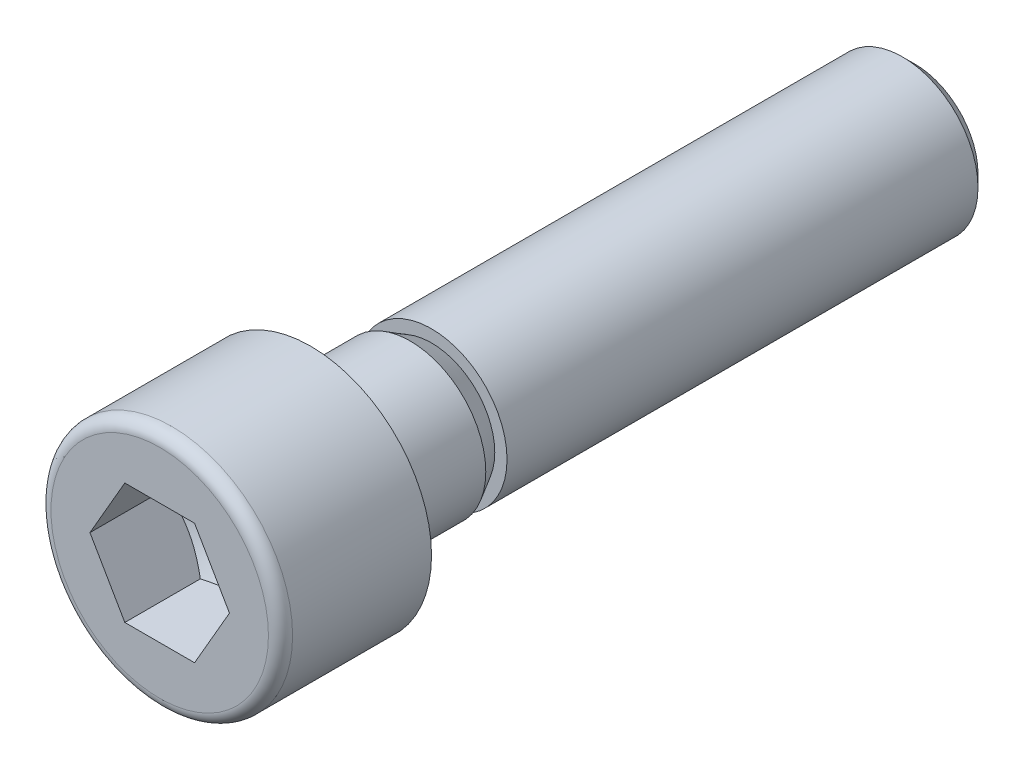
ISO-10303-21;
HEADER;
FILE_DESCRIPTION(('STEP AP214'),'2;1');
FILE_NAME('part.step','',(''),(''),'','','');
FILE_SCHEMA(('AUTOMOTIVE_DESIGN { 1 0 10303 214 1 1 1 1 }'));
ENDSEC;
DATA;
#1=APPLICATION_CONTEXT('core data for automotive mechanical design processes');
#2=APPLICATION_PROTOCOL_DEFINITION('international standard','automotive_design',2000,#1);
#3=PRODUCT_CONTEXT('',#1,'mechanical');
#4=PRODUCT('Part','Part','',(#3));
#5=PRODUCT_RELATED_PRODUCT_CATEGORY('part','',(#4));
#6=PRODUCT_DEFINITION_FORMATION('','',#4);
#7=PRODUCT_DEFINITION_CONTEXT('part definition',#1,'design');
#8=PRODUCT_DEFINITION('design','',#6,#7);
#9=PRODUCT_DEFINITION_SHAPE('','',#8);
#10=(LENGTH_UNIT() NAMED_UNIT(*) SI_UNIT(.MILLI.,.METRE.));
#11=(NAMED_UNIT(*) PLANE_ANGLE_UNIT() SI_UNIT($,.RADIAN.));
#12=(NAMED_UNIT(*) SI_UNIT($,.STERADIAN.) SOLID_ANGLE_UNIT());
#13=UNCERTAINTY_MEASURE_WITH_UNIT(LENGTH_MEASURE(1.E-05),#10,'distance_accuracy_value','');
#14=(GEOMETRIC_REPRESENTATION_CONTEXT(3) GLOBAL_UNCERTAINTY_ASSIGNED_CONTEXT((#13)) GLOBAL_UNIT_ASSIGNED_CONTEXT((#10,
#11,#12)) REPRESENTATION_CONTEXT('',''));
#15=CARTESIAN_POINT('',(0.,0.,0.));
#16=DIRECTION('',(0.,0.,1.));
#17=DIRECTION('',(1.,0.,0.));
#18=AXIS2_PLACEMENT_3D('',#15,#16,#17);
#19=CARTESIAN_POINT('',(0.,0.,10.));
#20=DIRECTION('',(0.,0.,1.));
#21=DIRECTION('',(1.,0.,0.));
#22=AXIS2_PLACEMENT_3D('',#19,#20,#21);
#23=PLANE('',#22);
#24=CARTESIAN_POINT('',(0.,0.,10.));
#25=DIRECTION('',(0.,0.,1.));
#26=DIRECTION('',(1.,0.,0.));
#27=AXIS2_PLACEMENT_3D('',#24,#25,#26);
#28=CIRCLE('',#27,7.2);
#29=CARTESIAN_POINT('',(7.2,0.,10.));
#30=VERTEX_POINT('',#29);
#31=EDGE_CURVE('E11',#30,#30,#28,.T.);
#32=ORIENTED_EDGE('',*,*,#31,.T.);
#33=EDGE_LOOP('',(#32));
#34=FACE_BOUND('',#33,.T.);
#35=DIRECTION('',(1.,0.,0.));
#36=VECTOR('',#35,1.);
#37=CARTESIAN_POINT('',(-2.3094,3.99999813499956,10.));
#38=LINE('',#37,#36);
#39=CARTESIAN_POINT('',(-2.3094,3.99999813499956,10.));
#40=VERTEX_POINT('',#39);
#41=CARTESIAN_POINT('',(2.3094,3.99999813499957,10.));
#42=VERTEX_POINT('',#41);
#43=EDGE_CURVE('E92',#40,#42,#38,.T.);
#44=ORIENTED_EDGE('',*,*,#43,.T.);
#45=DIRECTION('',(0.5,-0.866025403784439,0.));
#46=VECTOR('',#45,1.);
#47=CARTESIAN_POINT('',(2.3094,3.99999813499957,10.));
#48=LINE('',#47,#46);
#49=CARTESIAN_POINT('',(4.6188,0.,10.));
#50=VERTEX_POINT('',#49);
#51=EDGE_CURVE('E31',#42,#50,#48,.T.);
#52=ORIENTED_EDGE('',*,*,#51,.T.);
#53=DIRECTION('',(-0.5,-0.866025403784439,0.));
#54=VECTOR('',#53,1.);
#55=CARTESIAN_POINT('',(4.6188,0.,10.));
#56=LINE('',#55,#54);
#57=CARTESIAN_POINT('',(2.3094,-3.99999813499956,10.));
#58=VERTEX_POINT('',#57);
#59=EDGE_CURVE('E169',#50,#58,#56,.T.);
#60=ORIENTED_EDGE('',*,*,#59,.T.);
#61=DIRECTION('',(-1.,0.,0.));
#62=VECTOR('',#61,1.);
#63=CARTESIAN_POINT('',(2.3094,-3.99999813499956,10.));
#64=LINE('',#63,#62);
#65=CARTESIAN_POINT('',(-2.3094,-3.99999813499956,10.));
#66=VERTEX_POINT('',#65);
#67=EDGE_CURVE('E165',#58,#66,#64,.T.);
#68=ORIENTED_EDGE('',*,*,#67,.T.);
#69=DIRECTION('',(-0.5,0.866025403784439,0.));
#70=VECTOR('',#69,1.);
#71=CARTESIAN_POINT('',(-2.3094,-3.99999813499956,10.));
#72=LINE('',#71,#70);
#73=CARTESIAN_POINT('',(-4.6188,0.,10.));
#74=VERTEX_POINT('',#73);
#75=EDGE_CURVE('E160',#66,#74,#72,.T.);
#76=ORIENTED_EDGE('',*,*,#75,.T.);
#77=DIRECTION('',(0.5,0.866025403784439,0.));
#78=VECTOR('',#77,1.);
#79=CARTESIAN_POINT('',(-4.6188,0.,10.));
#80=LINE('',#79,#78);
#81=EDGE_CURVE('E96',#74,#40,#80,.T.);
#82=ORIENTED_EDGE('',*,*,#81,.T.);
#83=EDGE_LOOP('',(#44,#52,#60,#68,#76,#82));
#84=FACE_BOUND('',#83,.T.);
#85=ADVANCED_FACE('F17',(#34,#84),#23,.T.);
#86=CARTESIAN_POINT('',(0.,0.,9.2));
#87=DIRECTION('',(0.,0.,1.));
#88=DIRECTION('',(1.,0.,0.));
#89=AXIS2_PLACEMENT_3D('',#86,#87,#88);
#90=TOROIDAL_SURFACE('',#89,7.2,0.8);
#91=ORIENTED_EDGE('',*,*,#31,.F.);
#92=EDGE_LOOP('',(#91));
#93=FACE_BOUND('',#92,.T.);
#94=CARTESIAN_POINT('',(0.,0.,9.2));
#95=DIRECTION('',(0.,0.,1.));
#96=DIRECTION('',(1.,0.,0.));
#97=AXIS2_PLACEMENT_3D('',#94,#95,#96);
#98=CIRCLE('',#97,8.);
#99=CARTESIAN_POINT('',(8.,0.,9.2));
#100=VERTEX_POINT('',#99);
#101=EDGE_CURVE('E24',#100,#100,#98,.T.);
#102=ORIENTED_EDGE('',*,*,#101,.T.);
#103=EDGE_LOOP('',(#102));
#104=FACE_BOUND('',#103,.T.);
#105=ADVANCED_FACE('F133',(#93,#104),#90,.T.);
#106=CARTESIAN_POINT('',(0.,0.,10.));
#107=DIRECTION('',(0.,0.,1.));
#108=DIRECTION('',(1.,0.,0.));
#109=AXIS2_PLACEMENT_3D('',#106,#107,#108);
#110=CYLINDRICAL_SURFACE('',#109,8.);
#111=CARTESIAN_POINT('',(0.,0.,0.));
#112=DIRECTION('',(0.,0.,1.));
#113=DIRECTION('',(1.,0.,0.));
#114=AXIS2_PLACEMENT_3D('',#111,#112,#113);
#115=CIRCLE('',#114,8.);
#116=CARTESIAN_POINT('',(8.,0.,0.));
#117=VERTEX_POINT('',#116);
#118=EDGE_CURVE('E128',#117,#117,#115,.T.);
#119=ORIENTED_EDGE('',*,*,#118,.T.);
#120=EDGE_LOOP('',(#119));
#121=FACE_BOUND('',#120,.T.);
#122=ORIENTED_EDGE('',*,*,#101,.F.);
#123=EDGE_LOOP('',(#122));
#124=FACE_BOUND('',#123,.T.);
#125=ADVANCED_FACE('F135',(#121,#124),#110,.T.);
#126=CARTESIAN_POINT('',(0.,8.,0.));
#127=DIRECTION('',(0.,0.,-1.));
#128=DIRECTION('',(-1.,0.,0.));
#129=AXIS2_PLACEMENT_3D('',#126,#127,#128);
#130=PLANE('',#129);
#131=CARTESIAN_POINT('',(0.,0.,0.));
#132=DIRECTION('',(0.,0.,1.));
#133=DIRECTION('',(1.,0.,0.));
#134=AXIS2_PLACEMENT_3D('',#131,#132,#133);
#135=CIRCLE('',#134,5.5);
#136=CARTESIAN_POINT('',(5.5,0.,0.));
#137=VERTEX_POINT('',#136);
#138=EDGE_CURVE('E125',#137,#137,#135,.T.);
#139=ORIENTED_EDGE('',*,*,#138,.T.);
#140=EDGE_LOOP('',(#139));
#141=FACE_BOUND('',#140,.T.);
#142=ORIENTED_EDGE('',*,*,#118,.F.);
#143=EDGE_LOOP('',(#142));
#144=FACE_BOUND('',#143,.T.);
#145=ADVANCED_FACE('F137',(#141,#144),#130,.T.);
#146=CARTESIAN_POINT('',(0.,0.,-0.5));
#147=DIRECTION('',(0.,0.,1.));
#148=DIRECTION('',(1.,0.,0.));
#149=AXIS2_PLACEMENT_3D('',#146,#147,#148);
#150=TOROIDAL_SURFACE('',#149,5.5,0.5);
#151=CARTESIAN_POINT('',(0.,0.,-0.5));
#152=DIRECTION('',(0.,0.,1.));
#153=DIRECTION('',(1.,0.,0.));
#154=AXIS2_PLACEMENT_3D('',#151,#152,#153);
#155=CIRCLE('',#154,5.);
#156=CARTESIAN_POINT('',(5.,0.,-0.5));
#157=VERTEX_POINT('',#156);
#158=EDGE_CURVE('E122',#157,#157,#155,.T.);
#159=ORIENTED_EDGE('',*,*,#158,.T.);
#160=EDGE_LOOP('',(#159));
#161=FACE_BOUND('',#160,.T.);
#162=ORIENTED_EDGE('',*,*,#138,.F.);
#163=EDGE_LOOP('',(#162));
#164=FACE_BOUND('',#163,.T.);
#165=ADVANCED_FACE('F145',(#161,#164),#150,.F.);
#166=CARTESIAN_POINT('',(0.,0.,10.));
#167=DIRECTION('',(0.,0.,1.));
#168=DIRECTION('',(1.,0.,0.));
#169=AXIS2_PLACEMENT_3D('',#166,#167,#168);
#170=CYLINDRICAL_SURFACE('',#169,5.);
#171=CARTESIAN_POINT('',(0.,0.,-6.59379125060502));
#172=DIRECTION('',(0.,0.,1.));
#173=DIRECTION('',(1.,0.,0.));
#174=AXIS2_PLACEMENT_3D('',#171,#172,#173);
#175=CIRCLE('',#174,5.);
#176=CARTESIAN_POINT('',(5.,0.,-6.59379125060502));
#177=VERTEX_POINT('',#176);
#178=EDGE_CURVE('E119',#177,#177,#175,.T.);
#179=ORIENTED_EDGE('',*,*,#178,.T.);
#180=EDGE_LOOP('',(#179));
#181=FACE_BOUND('',#180,.T.);
#182=ORIENTED_EDGE('',*,*,#158,.F.);
#183=EDGE_LOOP('',(#182));
#184=FACE_BOUND('',#183,.T.);
#185=ADVANCED_FACE('F364',(#181,#184),#170,.T.);
#186=CARTESIAN_POINT('',(0.,0.,-6.59379125060502));
#187=DIRECTION('',(0.,0.,1.));
#188=DIRECTION('',(1.,0.,0.));
#189=AXIS2_PLACEMENT_3D('',#186,#187,#188);
#190=CONICAL_SURFACE('',#189,5.,0.523598775598299);
#191=CARTESIAN_POINT('',(0.,0.,-8.));
#192=DIRECTION('',(0.,0.,1.));
#193=DIRECTION('',(1.,0.,0.));
#194=AXIS2_PLACEMENT_3D('',#191,#192,#193);
#195=CIRCLE('',#194,4.188125);
#196=CARTESIAN_POINT('',(4.188125,0.,-8.));
#197=VERTEX_POINT('',#196);
#198=EDGE_CURVE('E116',#197,#197,#195,.T.);
#199=ORIENTED_EDGE('',*,*,#198,.T.);
#200=EDGE_LOOP('',(#199));
#201=FACE_BOUND('',#200,.T.);
#202=ORIENTED_EDGE('',*,*,#178,.F.);
#203=EDGE_LOOP('',(#202));
#204=FACE_BOUND('',#203,.T.);
#205=ADVANCED_FACE('F353',(#201,#204),#190,.T.);
#206=CARTESIAN_POINT('',(0.,4.188125,-8.));
#207=DIRECTION('',(0.,0.,1.));
#208=DIRECTION('',(1.,0.,0.));
#209=AXIS2_PLACEMENT_3D('',#206,#207,#208);
#210=PLANE('',#209);
#211=CARTESIAN_POINT('',(0.,0.,-8.));
#212=DIRECTION('',(0.,0.,1.));
#213=DIRECTION('',(1.,0.,0.));
#214=AXIS2_PLACEMENT_3D('',#211,#212,#213);
#215=CIRCLE('',#214,5.);
#216=CARTESIAN_POINT('',(5.,0.,-8.));
#217=VERTEX_POINT('',#216);
#218=EDGE_CURVE('E113',#217,#217,#215,.T.);
#219=ORIENTED_EDGE('',*,*,#218,.T.);
#220=EDGE_LOOP('',(#219));
#221=FACE_BOUND('',#220,.T.);
#222=ORIENTED_EDGE('',*,*,#198,.F.);
#223=EDGE_LOOP('',(#222));
#224=FACE_BOUND('',#223,.T.);
#225=ADVANCED_FACE('F342',(#221,#224),#210,.T.);
#226=CARTESIAN_POINT('',(0.,0.,10.));
#227=DIRECTION('',(0.,0.,1.));
#228=DIRECTION('',(1.,0.,0.));
#229=AXIS2_PLACEMENT_3D('',#226,#227,#228);
#230=CYLINDRICAL_SURFACE('',#229,5.);
#231=CARTESIAN_POINT('',(0.,0.,-39.188125));
#232=DIRECTION('',(0.,0.,1.));
#233=DIRECTION('',(1.,0.,0.));
#234=AXIS2_PLACEMENT_3D('',#231,#232,#233);
#235=CIRCLE('',#234,5.);
#236=CARTESIAN_POINT('',(5.,0.,-39.188125));
#237=VERTEX_POINT('',#236);
#238=EDGE_CURVE('E110',#237,#237,#235,.T.);
#239=ORIENTED_EDGE('',*,*,#238,.T.);
#240=EDGE_LOOP('',(#239));
#241=FACE_BOUND('',#240,.T.);
#242=ORIENTED_EDGE('',*,*,#218,.F.);
#243=EDGE_LOOP('',(#242));
#244=FACE_BOUND('',#243,.T.);
#245=ADVANCED_FACE('F331',(#241,#244),#230,.T.);
#246=CARTESIAN_POINT('',(0.,0.,-39.188125));
#247=DIRECTION('',(0.,0.,1.));
#248=DIRECTION('',(1.,0.,0.));
#249=AXIS2_PLACEMENT_3D('',#246,#247,#248);
#250=CONICAL_SURFACE('',#249,5.,0.785398163397448);
#251=CARTESIAN_POINT('',(0.,0.,-40.));
#252=DIRECTION('',(0.,0.,1.));
#253=DIRECTION('',(1.,0.,0.));
#254=AXIS2_PLACEMENT_3D('',#251,#252,#253);
#255=CIRCLE('',#254,4.188125);
#256=CARTESIAN_POINT('',(4.188125,0.,-40.));
#257=VERTEX_POINT('',#256);
#258=EDGE_CURVE('E107',#257,#257,#255,.T.);
#259=ORIENTED_EDGE('',*,*,#258,.T.);
#260=EDGE_LOOP('',(#259));
#261=FACE_BOUND('',#260,.T.);
#262=ORIENTED_EDGE('',*,*,#238,.F.);
#263=EDGE_LOOP('',(#262));
#264=FACE_BOUND('',#263,.T.);
#265=ADVANCED_FACE('F321',(#261,#264),#250,.T.);
#266=CARTESIAN_POINT('',(0.,4.188125,-40.));
#267=DIRECTION('',(0.,0.,-1.));
#268=DIRECTION('',(-1.,0.,0.));
#269=AXIS2_PLACEMENT_3D('',#266,#267,#268);
#270=PLANE('',#269);
#271=ORIENTED_EDGE('',*,*,#258,.F.);
#272=EDGE_LOOP('',(#271));
#273=FACE_BOUND('',#272,.T.);
#274=ADVANCED_FACE('F225',(#273),#270,.T.);
#275=CARTESIAN_POINT('',(2.3094,3.99999813499957,2.33333457666696));
#276=DIRECTION('',(-0.866025403784439,-0.5,0.));
#277=DIRECTION('',(-0.5,0.866025403784438,0.));
#278=AXIS2_PLACEMENT_3D('',#275,#276,#277);
#279=PLANE('',#278);
#280=DIRECTION('',(0.,0.,1.));
#281=VECTOR('',#280,1.);
#282=CARTESIAN_POINT('',(4.6188,0.,2.33333457666696));
#283=LINE('',#282,#281);
#284=CARTESIAN_POINT('',(4.6188,0.,5.));
#285=VERTEX_POINT('',#284);
#286=EDGE_CURVE('E105',#285,#50,#283,.T.);
#287=ORIENTED_EDGE('',*,*,#286,.T.);
#288=ORIENTED_EDGE('',*,*,#51,.F.);
#289=DIRECTION('',(0.,0.,1.));
#290=VECTOR('',#289,1.);
#291=CARTESIAN_POINT('',(2.3094,3.99999813499957,2.33333457666696));
#292=LINE('',#291,#290);
#293=CARTESIAN_POINT('',(2.3094,3.99999813499957,5.));
#294=VERTEX_POINT('',#293);
#295=EDGE_CURVE('E86',#294,#42,#292,.T.);
#296=ORIENTED_EDGE('',*,*,#295,.F.);
#297=CARTESIAN_POINT('',(4.61880011547006,-2.E-07,5.00000006666667));
#298=CARTESIAN_POINT('',(4.51731596975242,0.175775496545668,4.94139117877067));
#299=CARTESIAN_POINT('',(4.41495581433698,0.353068486395854,4.88808946175357));
#300=CARTESIAN_POINT('',(4.20846320572685,0.71072417589603,4.7950529136606));
#301=CARTESIAN_POINT('',(4.10432708475128,0.891093228328857,4.75535099179967));
#302=CARTESIAN_POINT('',(3.89734534960357,1.24959610984346,4.69355208547845));
#303=CARTESIAN_POINT('',(3.79453157331128,1.42767479409974,4.67104374713357));
#304=CARTESIAN_POINT('',(3.58842050010459,1.78466964489627,4.64417850885721));
#305=CARTESIAN_POINT('',(3.48512395183433,1.96358451474684,4.63979935685316));
#306=CARTESIAN_POINT('',(3.29212541755815,2.2978677818995,4.64893273589599));
#307=CARTESIAN_POINT('',(3.20239447061298,2.45328634101981,4.66020271965585));
#308=CARTESIAN_POINT('',(3.02351714459821,2.76311095799945,4.69591473701546));
#309=CARTESIAN_POINT('',(2.93437138375617,2.91751594505726,4.72036895784161));
#310=CARTESIAN_POINT('',(2.75512555330313,3.2279788304468,4.78149977936056));
#311=CARTESIAN_POINT('',(2.66504815823741,3.38399745531407,4.81843538881991));
#312=CARTESIAN_POINT('',(2.48623648421218,3.69370835971222,4.90226360820785));
#313=CARTESIAN_POINT('',(2.39749991623392,3.84740460393986,4.94913653447236));
#314=CARTESIAN_POINT('',(2.30939988452995,3.99999833499956,5.00000006666667));
#315=B_SPLINE_CURVE_WITH_KNOTS('',3,(#297,#298,#299,#300,#301,#302,#303,#304,#305,#306,#307,
#308,#309,#310,#311,#312,#313,#314),.UNSPECIFIED.,.F.,.F.,(4,2,2,2,2,2,2,2,4),(0.,
0.634031743308237,1.26958707416591,1.88941437772395,2.50848066870243,3.04741430709299,
3.58684698049291,4.13824168880611,4.6885542415222),.UNSPECIFIED.);
#316=EDGE_CURVE('E79',#285,#294,#315,.T.);
#317=ORIENTED_EDGE('',*,*,#316,.F.);
#318=EDGE_LOOP('',(#287,#288,#296,#317));
#319=FACE_BOUND('',#318,.T.);
#320=ADVANCED_FACE('F87',(#319),#279,.T.);
#321=CARTESIAN_POINT('',(4.6188,0.,2.33333457666696));
#322=DIRECTION('',(-0.866025403784439,0.5,0.));
#323=DIRECTION('',(0.5,0.866025403784439,0.));
#324=AXIS2_PLACEMENT_3D('',#321,#322,#323);
#325=PLANE('',#324);
#326=DIRECTION('',(0.,0.,1.));
#327=VECTOR('',#326,1.);
#328=CARTESIAN_POINT('',(2.3094,-3.99999813499956,2.33333457666696));
#329=LINE('',#328,#327);
#330=CARTESIAN_POINT('',(2.3094,-3.99999813499956,5.));
#331=VERTEX_POINT('',#330);
#332=EDGE_CURVE('E103',#331,#58,#329,.T.);
#333=ORIENTED_EDGE('',*,*,#332,.T.);
#334=ORIENTED_EDGE('',*,*,#59,.F.);
#335=ORIENTED_EDGE('',*,*,#286,.F.);
#336=CARTESIAN_POINT('',(2.30939988452995,-3.99999833499956,5.00000006666667));
#337=CARTESIAN_POINT('',(2.41088403024758,-3.8242226384539,4.94139117877067));
#338=CARTESIAN_POINT('',(2.51324418566302,-3.64692964860371,4.88808946175357));
#339=CARTESIAN_POINT('',(2.71973679427315,-3.28927395910354,4.7950529136606));
#340=CARTESIAN_POINT('',(2.82387291524872,-3.10890490667071,4.75535099179967));
#341=CARTESIAN_POINT('',(3.03085465039643,-2.75040202515611,4.69355208547845));
#342=CARTESIAN_POINT('',(3.13366842668873,-2.57232334089983,4.67104374713356));
#343=CARTESIAN_POINT('',(3.33977949989541,-2.2153284901033,4.64417850885721));
#344=CARTESIAN_POINT('',(3.44307604816567,-2.03641362025273,4.63979935685316));
#345=CARTESIAN_POINT('',(3.63607458244185,-1.70213035310006,4.648932735896));
#346=CARTESIAN_POINT('',(3.72580552938702,-1.54671179397976,4.66020271965585));
#347=CARTESIAN_POINT('',(3.90468285540179,-1.23688717700011,4.69591473701546));
#348=CARTESIAN_POINT('',(3.99382861624383,-1.08248218994231,4.72036895784161));
#349=CARTESIAN_POINT('',(4.17307444669687,-0.772019304552768,4.78149977936055));
#350=CARTESIAN_POINT('',(4.26315184176259,-0.61600067968549,4.8184353888199));
#351=CARTESIAN_POINT('',(4.44196351578782,-0.306289775287344,4.90226360820785));
#352=CARTESIAN_POINT('',(4.53070008376609,-0.152593531059702,4.94913653447236));
#353=CARTESIAN_POINT('',(4.61880011547006,1.99999999792358E-07,5.00000006666667));
#354=B_SPLINE_CURVE_WITH_KNOTS('',3,(#336,#337,#338,#339,#340,#341,#342,#343,#344,#345,#346,
#347,#348,#349,#350,#351,#352,#353),.UNSPECIFIED.,.F.,.F.,(4,2,2,2,2,2,2,2,4),(0.,
0.634031743308236,1.26958707416591,1.88941437772395,2.50848066870243,3.04741430709299,
3.58684698049291,4.13824168880611,4.6885542415222),.UNSPECIFIED.);
#355=EDGE_CURVE('E83',#331,#285,#354,.T.);
#356=ORIENTED_EDGE('',*,*,#355,.F.);
#357=EDGE_LOOP('',(#333,#334,#335,#356));
#358=FACE_BOUND('',#357,.T.);
#359=ADVANCED_FACE('F216',(#358),#325,.T.);
#360=CARTESIAN_POINT('',(2.3094,-3.99999813499956,2.33333457666696));
#361=DIRECTION('',(0.,1.,0.));
#362=DIRECTION('',(1.,0.,0.));
#363=AXIS2_PLACEMENT_3D('',#360,#361,#362);
#364=PLANE('',#363);
#365=DIRECTION('',(0.,0.,1.));
#366=VECTOR('',#365,1.);
#367=CARTESIAN_POINT('',(-2.3094,-3.99999813499956,2.33333457666696));
#368=LINE('',#367,#366);
#369=CARTESIAN_POINT('',(-2.3094,-3.99999813499957,5.));
#370=VERTEX_POINT('',#369);
#371=EDGE_CURVE('E101',#370,#66,#368,.T.);
#372=ORIENTED_EDGE('',*,*,#371,.T.);
#373=ORIENTED_EDGE('',*,*,#67,.F.);
#374=ORIENTED_EDGE('',*,*,#332,.F.);
#375=CARTESIAN_POINT('',(-5.98057769943966,-3.99999813499956,6.48734046251718));
#376=CARTESIAN_POINT('',(-5.80634385912593,-3.99999813499957,6.40375038129349));
#377=CARTESIAN_POINT('',(-5.63168209776621,-3.99999813499957,6.32103522592822));
#378=CARTESIAN_POINT('',(-5.28127125241568,-3.99999813499957,6.15785706531401));
#379=CARTESIAN_POINT('',(-5.10552197120652,-3.99999813499957,6.0773944841024));
#380=CARTESIAN_POINT('',(-4.75169185819257,-3.99999813499957,5.91877225875572));
#381=CARTESIAN_POINT('',(-4.57360334159642,-3.99999813499957,5.84062969131583));
#382=CARTESIAN_POINT('',(-4.21591252909111,-3.99999813499957,5.6879033866581));
#383=CARTESIAN_POINT('',(-4.03631031769862,-3.99999813499957,5.61331945227384));
#384=CARTESIAN_POINT('',(-3.67372739648015,-3.99999813499957,5.46803650828329));
#385=CARTESIAN_POINT('',(-3.49073090183029,-3.99999813499957,5.39737666668677));
#386=CARTESIAN_POINT('',(-3.12253565794429,-3.99999813499957,5.26193338774639));
#387=CARTESIAN_POINT('',(-2.93733666262375,-3.99999813499957,5.19715061415591));
#388=CARTESIAN_POINT('',(-2.56486875604118,-3.99999813499957,5.07529545963008));
#389=CARTESIAN_POINT('',(-2.37760564994107,-3.99999813499957,5.01820552373651));
#390=CARTESIAN_POINT('',(-2.00043406162686,-3.99999813499957,4.91366929255564));
#391=CARTESIAN_POINT('',(-1.81052646930233,-3.99999813499956,4.86621983314915));
#392=CARTESIAN_POINT('',(-1.42743382834547,-3.99999813499956,4.78323057739448));
#393=CARTESIAN_POINT('',(-1.23424018509159,-3.99999813499957,4.74772968311017));
#394=CARTESIAN_POINT('',(-0.84568086068928,-3.99999813499957,4.69129080776627));
#395=CARTESIAN_POINT('',(-0.650315148594066,-3.99999813499957,4.67035303446711));
#396=CARTESIAN_POINT('',(-0.259563873743041,-3.99999813499957,4.64489362964312));
#397=CARTESIAN_POINT('',(-0.0641842773872157,-3.99999813499956,4.64028273605791));
#398=CARTESIAN_POINT('',(0.326217426011321,-3.99999813499956,4.64766335794575));
#399=CARTESIAN_POINT('',(0.521239602425261,-3.99999813499956,4.65965121010483));
#400=CARTESIAN_POINT('',(0.858587464125007,-3.99999813499956,4.69392875772315));
#401=CARTESIAN_POINT('',(1.00128992733535,-3.99999813499956,4.7126822419693));
#402=CARTESIAN_POINT('',(1.28549923966593,-3.99999813499956,4.75778211303507));
#403=CARTESIAN_POINT('',(1.4270058880511,-3.99999813499956,4.78412974957017));
#404=CARTESIAN_POINT('',(1.84999884917977,-3.99999813499956,4.87324006695584));
#405=CARTESIAN_POINT('',(2.12939329115907,-3.99999813499956,4.9460057011246));
#406=CARTESIAN_POINT('',(2.54704256482357,-3.99999813499956,5.07029059965773));
#407=CARTESIAN_POINT('',(2.68750495956953,-3.99999813499956,5.11479931034815));
#408=CARTESIAN_POINT('',(2.96707353830311,-3.99999813499956,5.20796385174561));
#409=CARTESIAN_POINT('',(3.10617960498509,-3.99999813499956,5.25662003767419));
#410=CARTESIAN_POINT('',(3.38233764002496,-3.99999813499956,5.35705946377575));
#411=CARTESIAN_POINT('',(3.51939682833038,-3.99999813499956,5.40882304878701));
#412=CARTESIAN_POINT('',(3.79237111729086,-3.99999813499956,5.51515891272153));
#413=CARTESIAN_POINT('',(3.92828658178818,-3.99999813499956,5.56973025584892));
#414=CARTESIAN_POINT('',(4.06372392451126,-3.99999813499956,5.62543811972496));
#415=B_SPLINE_CURVE_WITH_KNOTS('',3,(#375,#376,#377,#378,#379,#380,#381,#382,#383,#384,#385,
#386,#387,#388,#389,#390,#391,#392,#393,#394,#395,#396,#397,#398,#399,#400,#401,#402,#403,#404,
#405,#406,#407,#408,#409,#410,#411,#412,#413,#414),.UNSPECIFIED.,.F.,.F.,(4,2,2,2,2,2,2,2,2,2,2,
2,2,2,2,2,2,2,2,4),(0.,0.579752123938161,1.15961265969032,1.74301648077971,2.32638794069657,
2.91480363088888,3.50328569396402,4.09040124492337,4.67732378516358,5.26613914562134,
5.85496290606561,6.4405624451103,7.02603276396525,7.45760764225355,7.88925358233053,
8.75424356485996,9.19624933400552,9.63829299802161,10.0777870105018,10.5171354813762),.UNSPECIFIED.);
#416=EDGE_CURVE('E207',#370,#331,#415,.T.);
#417=ORIENTED_EDGE('',*,*,#416,.F.);
#418=EDGE_LOOP('',(#372,#373,#374,#417));
#419=FACE_BOUND('',#418,.T.);
#420=ADVANCED_FACE('F212',(#419),#364,.T.);
#421=CARTESIAN_POINT('',(-2.3094,-3.99999813499956,2.33333457666696));
#422=DIRECTION('',(0.866025403784439,0.5,0.));
#423=DIRECTION('',(0.5,-0.866025403784439,0.));
#424=AXIS2_PLACEMENT_3D('',#421,#422,#423);
#425=PLANE('',#424);
#426=DIRECTION('',(0.,0.,1.));
#427=VECTOR('',#426,1.);
#428=CARTESIAN_POINT('',(-4.6188,0.,2.33333457666696));
#429=LINE('',#428,#427);
#430=CARTESIAN_POINT('',(-4.6188,0.,5.));
#431=VERTEX_POINT('',#430);
#432=EDGE_CURVE('E94',#431,#74,#429,.T.);
#433=ORIENTED_EDGE('',*,*,#432,.T.);
#434=ORIENTED_EDGE('',*,*,#75,.F.);
#435=ORIENTED_EDGE('',*,*,#371,.F.);
#436=CARTESIAN_POINT('',(-4.61880011547006,2.00000001195625E-07,5.00000006666667));
#437=CARTESIAN_POINT('',(-4.51731596975242,-0.175775496545666,4.94139117877067));
#438=CARTESIAN_POINT('',(-4.41495581433698,-0.353068486395852,4.88808946175357));
#439=CARTESIAN_POINT('',(-4.20846320572685,-0.710724175896028,4.7950529136606));
#440=CARTESIAN_POINT('',(-4.10432708475128,-0.891093228328855,4.75535099179967));
#441=CARTESIAN_POINT('',(-3.89734534960357,-1.24959610984346,4.69355208547845));
#442=CARTESIAN_POINT('',(-3.79453157331127,-1.42767479409974,4.67104374713356));
#443=CARTESIAN_POINT('',(-3.58842050010459,-1.78466964489627,4.64417850885721));
#444=CARTESIAN_POINT('',(-3.48512395183433,-1.96358451474684,4.63979935685316));
#445=CARTESIAN_POINT('',(-3.29212541755815,-2.2978677818995,4.648932735896));
#446=CARTESIAN_POINT('',(-3.20239447061298,-2.45328634101981,4.66020271965585));
#447=CARTESIAN_POINT('',(-3.02351714459821,-2.76311095799945,4.69591473701545));
#448=CARTESIAN_POINT('',(-2.93437138375617,-2.91751594505726,4.72036895784161));
#449=CARTESIAN_POINT('',(-2.75512555330313,-3.2279788304468,4.78149977936055));
#450=CARTESIAN_POINT('',(-2.66504815823741,-3.38399745531407,4.8184353888199));
#451=CARTESIAN_POINT('',(-2.48623648421218,-3.69370835971222,4.90226360820785));
#452=CARTESIAN_POINT('',(-2.39749991623391,-3.84740460393986,4.94913653447236));
#453=CARTESIAN_POINT('',(-2.30939988452995,-3.99999833499956,5.00000006666667));
#454=B_SPLINE_CURVE_WITH_KNOTS('',3,(#436,#437,#438,#439,#440,#441,#442,#443,#444,#445,#446,
#447,#448,#449,#450,#451,#452,#453),.UNSPECIFIED.,.F.,.F.,(4,2,2,2,2,2,2,2,4),(0.,
0.634031743308237,1.26958707416591,1.88941437772395,2.50848066870244,3.047414307093,
3.58684698049291,4.13824168880611,4.6885542415222),.UNSPECIFIED.);
#455=EDGE_CURVE('E202',#431,#370,#454,.T.);
#456=ORIENTED_EDGE('',*,*,#455,.F.);
#457=EDGE_LOOP('',(#433,#434,#435,#456));
#458=FACE_BOUND('',#457,.T.);
#459=ADVANCED_FACE('F215',(#458),#425,.T.);
#460=CARTESIAN_POINT('',(-4.6188,0.,2.33333457666696));
#461=DIRECTION('',(0.866025403784439,-0.5,0.));
#462=DIRECTION('',(-0.5,-0.866025403784439,0.));
#463=AXIS2_PLACEMENT_3D('',#460,#461,#462);
#464=PLANE('',#463);
#465=DIRECTION('',(0.,0.,1.));
#466=VECTOR('',#465,1.);
#467=CARTESIAN_POINT('',(-2.3094,3.99999813499956,2.33333457666696));
#468=LINE('',#467,#466);
#469=CARTESIAN_POINT('',(-2.3094,3.99999813499956,5.));
#470=VERTEX_POINT('',#469);
#471=EDGE_CURVE('E91',#470,#40,#468,.T.);
#472=ORIENTED_EDGE('',*,*,#471,.T.);
#473=ORIENTED_EDGE('',*,*,#81,.F.);
#474=ORIENTED_EDGE('',*,*,#432,.F.);
#475=CARTESIAN_POINT('',(-2.30939988452995,3.99999833499956,5.00000006666667));
#476=CARTESIAN_POINT('',(-2.41088403024758,3.8242226384539,4.94139117877067));
#477=CARTESIAN_POINT('',(-2.51324418566302,3.64692964860371,4.88808946175357));
#478=CARTESIAN_POINT('',(-2.71973679427315,3.28927395910353,4.7950529136606));
#479=CARTESIAN_POINT('',(-2.82387291524872,3.1089049066707,4.75535099179967));
#480=CARTESIAN_POINT('',(-3.03085465039643,2.7504020251561,4.69355208547845));
#481=CARTESIAN_POINT('',(-3.13366842668873,2.57232334089982,4.67104374713356));
#482=CARTESIAN_POINT('',(-3.33977949989542,2.21532849010329,4.64417850885721));
#483=CARTESIAN_POINT('',(-3.44307604816567,2.03641362025272,4.63979935685316));
#484=CARTESIAN_POINT('',(-3.63607458244185,1.70213035310006,4.648932735896));
#485=CARTESIAN_POINT('',(-3.72580552938702,1.54671179397975,4.66020271965585));
#486=CARTESIAN_POINT('',(-3.90468285540179,1.23688717700011,4.69591473701546));
#487=CARTESIAN_POINT('',(-3.99382861624383,1.08248218994231,4.72036895784161));
#488=CARTESIAN_POINT('',(-4.17307444669687,0.772019304552769,4.78149977936055));
#489=CARTESIAN_POINT('',(-4.26315184176259,0.616000679685492,4.8184353888199));
#490=CARTESIAN_POINT('',(-4.44196351578782,0.306289775287347,4.90226360820785));
#491=CARTESIAN_POINT('',(-4.53070008376608,0.152593531059704,4.94913653447236));
#492=CARTESIAN_POINT('',(-4.61880011547005,-1.99999998733441E-07,5.00000006666667));
#493=B_SPLINE_CURVE_WITH_KNOTS('',3,(#475,#476,#477,#478,#479,#480,#481,#482,#483,#484,#485,
#486,#487,#488,#489,#490,#491,#492),.UNSPECIFIED.,.F.,.F.,(4,2,2,2,2,2,2,2,4),(0.,
0.634031743308237,1.26958707416591,1.88941437772395,2.50848066870243,3.04741430709299,
3.58684698049291,4.1382416888061,4.68855424152219),.UNSPECIFIED.);
#494=EDGE_CURVE('E39',#470,#431,#493,.T.);
#495=ORIENTED_EDGE('',*,*,#494,.F.);
#496=EDGE_LOOP('',(#472,#473,#474,#495));
#497=FACE_BOUND('',#496,.T.);
#498=ADVANCED_FACE('F159',(#497),#464,.T.);
#499=CARTESIAN_POINT('',(-2.3094,3.99999813499956,2.33333457666696));
#500=DIRECTION('',(0.,-1.,0.));
#501=DIRECTION('',(-1.,0.,0.));
#502=AXIS2_PLACEMENT_3D('',#499,#500,#501);
#503=PLANE('',#502);
#504=ORIENTED_EDGE('',*,*,#295,.T.);
#505=ORIENTED_EDGE('',*,*,#43,.F.);
#506=ORIENTED_EDGE('',*,*,#471,.F.);
#507=CARTESIAN_POINT('',(-5.98057769943966,3.99999813499956,6.48734046251718));
#508=CARTESIAN_POINT('',(-5.80634385912593,3.99999813499956,6.4037503812935));
#509=CARTESIAN_POINT('',(-5.63168209776621,3.99999813499956,6.32103522592822));
#510=CARTESIAN_POINT('',(-5.28127125241568,3.99999813499956,6.15785706531401));
#511=CARTESIAN_POINT('',(-5.10552197120652,3.99999813499956,6.0773944841024));
#512=CARTESIAN_POINT('',(-4.75169185819257,3.99999813499956,5.91877225875572));
#513=CARTESIAN_POINT('',(-4.57360334159642,3.99999813499956,5.84062969131583));
#514=CARTESIAN_POINT('',(-4.21591252909111,3.99999813499956,5.6879033866581));
#515=CARTESIAN_POINT('',(-4.03631031769862,3.99999813499956,5.61331945227384));
#516=CARTESIAN_POINT('',(-3.67372739648015,3.99999813499956,5.46803650828329));
#517=CARTESIAN_POINT('',(-3.49073090183029,3.99999813499956,5.39737666668677));
#518=CARTESIAN_POINT('',(-3.12253565794429,3.99999813499956,5.26193338774639));
#519=CARTESIAN_POINT('',(-2.93733666262375,3.99999813499956,5.19715061415591));
#520=CARTESIAN_POINT('',(-2.56486875604118,3.99999813499956,5.07529545963008));
#521=CARTESIAN_POINT('',(-2.37760564994107,3.99999813499956,5.01820552373651));
#522=CARTESIAN_POINT('',(-2.00043406162686,3.99999813499956,4.91366929255564));
#523=CARTESIAN_POINT('',(-1.81052646930233,3.99999813499956,4.86621983314915));
#524=CARTESIAN_POINT('',(-1.42743382834547,3.99999813499956,4.78323057739448));
#525=CARTESIAN_POINT('',(-1.23424018509159,3.99999813499957,4.74772968311017));
#526=CARTESIAN_POINT('',(-0.845680860689281,3.99999813499957,4.69129080776627));
#527=CARTESIAN_POINT('',(-0.650315148594068,3.99999813499957,4.67035303446711));
#528=CARTESIAN_POINT('',(-0.259563873743044,3.99999813499957,4.64489362964312));
#529=CARTESIAN_POINT('',(-0.0641842773872183,3.99999813499957,4.64028273605791));
#530=CARTESIAN_POINT('',(0.326217426011319,3.99999813499957,4.64766335794575));
#531=CARTESIAN_POINT('',(0.521239602425258,3.99999813499956,4.65965121010483));
#532=CARTESIAN_POINT('',(0.858587464125004,3.99999813499956,4.69392875772315));
#533=CARTESIAN_POINT('',(1.00128992733534,3.99999813499957,4.7126822419693));
#534=CARTESIAN_POINT('',(1.28549923966592,3.99999813499957,4.75778211303507));
#535=CARTESIAN_POINT('',(1.42700588805109,3.99999813499957,4.78412974957017));
#536=CARTESIAN_POINT('',(1.84999884917977,3.99999813499957,4.87324006695584));
#537=CARTESIAN_POINT('',(2.12939329115907,3.99999813499957,4.9460057011246));
#538=CARTESIAN_POINT('',(2.54704256482357,3.99999813499957,5.07029059965773));
#539=CARTESIAN_POINT('',(2.68750495956952,3.99999813499957,5.11479931034815));
#540=CARTESIAN_POINT('',(2.96707353830311,3.99999813499957,5.20796385174561));
#541=CARTESIAN_POINT('',(3.10617960498509,3.99999813499957,5.25662003767419));
#542=CARTESIAN_POINT('',(3.38233764002496,3.99999813499957,5.35705946377575));
#543=CARTESIAN_POINT('',(3.51939682833038,3.99999813499957,5.40882304878701));
#544=CARTESIAN_POINT('',(3.79237111729086,3.99999813499957,5.51515891272153));
#545=CARTESIAN_POINT('',(3.92828658178818,3.99999813499957,5.56973025584892));
#546=CARTESIAN_POINT('',(4.06372392451126,3.99999813499957,5.62543811972496));
#547=B_SPLINE_CURVE_WITH_KNOTS('',3,(#507,#508,#509,#510,#511,#512,#513,#514,#515,#516,#517,
#518,#519,#520,#521,#522,#523,#524,#525,#526,#527,#528,#529,#530,#531,#532,#533,#534,#535,#536,
#537,#538,#539,#540,#541,#542,#543,#544,#545,#546),.UNSPECIFIED.,.F.,.F.,(4,2,2,2,2,2,2,2,2,2,2,
2,2,2,2,2,2,2,2,4),(0.,0.579752123938161,1.15961265969032,1.74301648077971,2.32638794069657,
2.91480363088888,3.50328569396402,4.09040124492338,4.67732378516358,5.26613914562134,
5.85496290606561,6.44056244511029,7.02603276396524,7.45760764225355,7.88925358233053,
8.75424356485996,9.19624933400552,9.6382929980216,10.0777870105018,10.5171354813762),.UNSPECIFIED.);
#548=EDGE_CURVE('E80',#294,#470,#547,.F.);
#549=ORIENTED_EDGE('',*,*,#548,.F.);
#550=EDGE_LOOP('',(#504,#505,#506,#549));
#551=FACE_BOUND('',#550,.T.);
#552=ADVANCED_FACE('F75',(#551),#503,.T.);
#553=CARTESIAN_POINT('',(0.,0.,2.33333457666696));
#554=DIRECTION('',(0.,0.,1.));
#555=DIRECTION('',(1.,0.,0.));
#556=AXIS2_PLACEMENT_3D('',#553,#554,#555);
#557=CONICAL_SURFACE('',#556,0.,1.0471975511966);
#558=CARTESIAN_POINT('',(0.,0.,2.33333457666696));
#559=VERTEX_POINT('',#558);
#560=VERTEX_LOOP('',#559);
#561=FACE_BOUND('',#560,.T.);
#562=ORIENTED_EDGE('',*,*,#316,.T.);
#563=ORIENTED_EDGE('',*,*,#548,.T.);
#564=ORIENTED_EDGE('',*,*,#494,.T.);
#565=ORIENTED_EDGE('',*,*,#455,.T.);
#566=ORIENTED_EDGE('',*,*,#416,.T.);
#567=ORIENTED_EDGE('',*,*,#355,.T.);
#568=EDGE_LOOP('',(#562,#563,#564,#565,#566,#567));
#569=FACE_BOUND('',#568,.T.);
#570=ADVANCED_FACE('F72',(#561,#569),#557,.F.);
#571=CLOSED_SHELL('',(#85,#105,#125,#145,#165,#185,#205,#225,#245,#265,#274,#320,#359,#420,#459,
#498,#552,#570));
#572=MANIFOLD_SOLID_BREP('B1',#571);
#573=ADVANCED_BREP_SHAPE_REPRESENTATION('',(#18,#572),#14);
#574=SHAPE_DEFINITION_REPRESENTATION(#9,#573);
ENDSEC;
END-ISO-10303-21;
